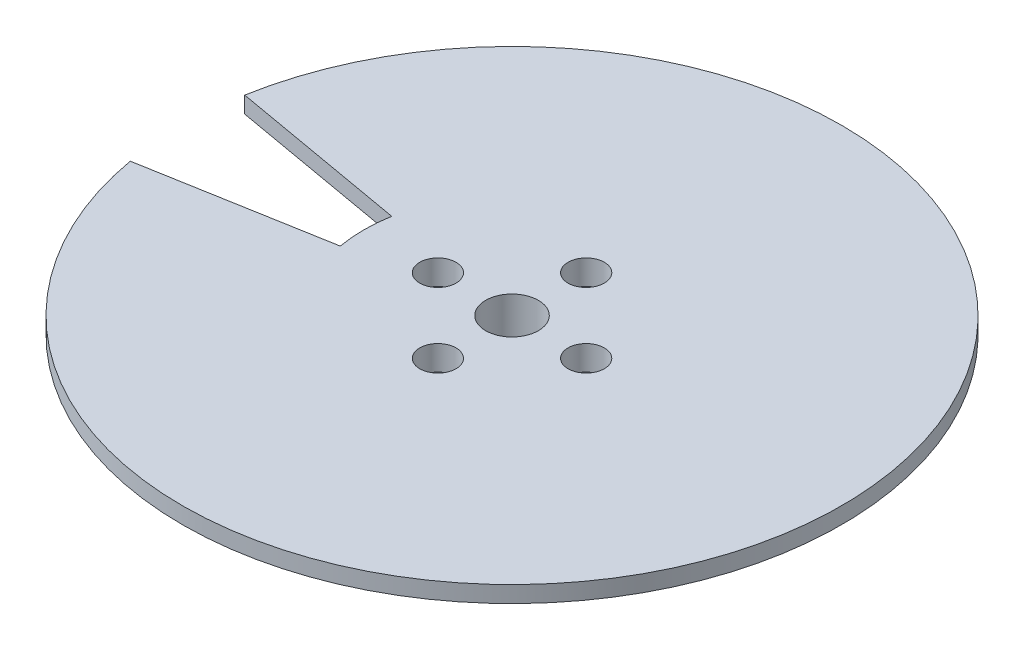
ISO-10303-21;
HEADER;
FILE_DESCRIPTION(('STEP AP214'),'2;1');
FILE_NAME('part.step','',(''),(''),'','','');
FILE_SCHEMA(('AUTOMOTIVE_DESIGN { 1 0 10303 214 1 1 1 1 }'));
ENDSEC;
DATA;
#1=APPLICATION_CONTEXT('core data for automotive mechanical design processes');
#2=APPLICATION_PROTOCOL_DEFINITION('international standard','automotive_design',2000,#1);
#3=PRODUCT_CONTEXT('',#1,'mechanical');
#4=PRODUCT('Part','Part','',(#3));
#5=PRODUCT_RELATED_PRODUCT_CATEGORY('part','',(#4));
#6=PRODUCT_DEFINITION_FORMATION('','',#4);
#7=PRODUCT_DEFINITION_CONTEXT('part definition',#1,'design');
#8=PRODUCT_DEFINITION('design','',#6,#7);
#9=PRODUCT_DEFINITION_SHAPE('','',#8);
#10=(LENGTH_UNIT() NAMED_UNIT(*) SI_UNIT(.MILLI.,.METRE.));
#11=(NAMED_UNIT(*) PLANE_ANGLE_UNIT() SI_UNIT($,.RADIAN.));
#12=(NAMED_UNIT(*) SI_UNIT($,.STERADIAN.) SOLID_ANGLE_UNIT());
#13=UNCERTAINTY_MEASURE_WITH_UNIT(LENGTH_MEASURE(1.E-05),#10,'distance_accuracy_value','');
#14=(GEOMETRIC_REPRESENTATION_CONTEXT(3) GLOBAL_UNCERTAINTY_ASSIGNED_CONTEXT((#13)) GLOBAL_UNIT_ASSIGNED_CONTEXT((#10,
#11,#12)) REPRESENTATION_CONTEXT('',''));
#15=CARTESIAN_POINT('',(0.,0.,0.));
#16=DIRECTION('',(0.,0.,1.));
#17=DIRECTION('',(1.,0.,0.));
#18=AXIS2_PLACEMENT_3D('',#15,#16,#17);
#19=CARTESIAN_POINT('',(0.,6.,0.));
#20=DIRECTION('',(0.,-1.,0.));
#21=DIRECTION('',(0.,0.,-1.));
#22=AXIS2_PLACEMENT_3D('',#19,#20,#21);
#23=CYLINDRICAL_SURFACE('',#22,7.5);
#24=DIRECTION('',(0.,-1.,0.));
#25=VECTOR('',#24,1.);
#26=CARTESIAN_POINT('',(0.85655319119696,3.,7.4509272329456));
#27=LINE('',#26,#25);
#28=CARTESIAN_POINT('',(0.856553191196959,3.,7.45092723294559));
#29=VERTEX_POINT('',#28);
#30=CARTESIAN_POINT('',(0.856553191196959,0.,7.45092723294559));
#31=VERTEX_POINT('',#30);
#32=EDGE_CURVE('E198',#29,#31,#27,.T.);
#33=ORIENTED_EDGE('',*,*,#32,.F.);
#34=CARTESIAN_POINT('',(0.,3.,0.));
#35=DIRECTION('',(0.,1.,0.));
#36=DIRECTION('',(0.,0.,1.));
#37=AXIS2_PLACEMENT_3D('',#34,#35,#36);
#38=CIRCLE('',#37,7.5);
#39=CARTESIAN_POINT('',(7.44042990767575,3.,0.943399591352612));
#40=VERTEX_POINT('',#39);
#41=EDGE_CURVE('E180',#29,#40,#38,.T.);
#42=ORIENTED_EDGE('',*,*,#41,.T.);
#43=DIRECTION('',(0.,-1.,0.));
#44=VECTOR('',#43,1.);
#45=CARTESIAN_POINT('',(7.44042990767575,3.,0.943399591352612));
#46=LINE('',#45,#44);
#47=CARTESIAN_POINT('',(7.44042990767575,0.,0.943399591352612));
#48=VERTEX_POINT('',#47);
#49=EDGE_CURVE('E356',#40,#48,#46,.T.);
#50=ORIENTED_EDGE('',*,*,#49,.T.);
#51=CARTESIAN_POINT('',(0.,0.,0.));
#52=DIRECTION('',(0.,1.,0.));
#53=DIRECTION('',(0.,0.,1.));
#54=AXIS2_PLACEMENT_3D('',#51,#52,#53);
#55=CIRCLE('',#54,7.5);
#56=EDGE_CURVE('E207',#31,#48,#55,.T.);
#57=ORIENTED_EDGE('',*,*,#56,.F.);
#58=EDGE_LOOP('',(#33,#42,#50,#57));
#59=FACE_BOUND('',#58,.T.);
#60=ADVANCED_FACE('F43',(#59),#23,.F.);
#61=DIRECTION('',(0.,-1.,0.));
#62=VECTOR('',#61,1.);
#63=CARTESIAN_POINT('',(7.45092723294559,3.,-0.856553191196986));
#64=LINE('',#63,#62);
#65=CARTESIAN_POINT('',(7.45092723294559,3.,-0.856553191196986));
#66=VERTEX_POINT('',#65);
#67=CARTESIAN_POINT('',(7.45092723294559,0.,-0.856553191196986));
#68=VERTEX_POINT('',#67);
#69=EDGE_CURVE('E352',#66,#68,#64,.T.);
#70=ORIENTED_EDGE('',*,*,#69,.F.);
#71=CARTESIAN_POINT('',(0.943399591352586,3.,-7.44042990767575));
#72=VERTEX_POINT('',#71);
#73=EDGE_CURVE('E192',#66,#72,#38,.T.);
#74=ORIENTED_EDGE('',*,*,#73,.T.);
#75=DIRECTION('',(0.,-1.,0.));
#76=VECTOR('',#75,1.);
#77=CARTESIAN_POINT('',(0.943399591352589,3.,-7.44042990767575));
#78=LINE('',#77,#76);
#79=CARTESIAN_POINT('',(0.943399591352589,0.,-7.44042990767575));
#80=VERTEX_POINT('',#79);
#81=EDGE_CURVE('E330',#72,#80,#78,.T.);
#82=ORIENTED_EDGE('',*,*,#81,.T.);
#83=EDGE_CURVE('E249',#68,#80,#55,.T.);
#84=ORIENTED_EDGE('',*,*,#83,.F.);
#85=EDGE_LOOP('',(#70,#74,#82,#84));
#86=FACE_BOUND('',#85,.T.);
#87=ADVANCED_FACE('F274',(#86),#23,.F.);
#88=DIRECTION('',(0.,-1.,0.));
#89=VECTOR('',#88,1.);
#90=CARTESIAN_POINT('',(-0.856553191197012,3.,-7.45092723294559));
#91=LINE('',#90,#89);
#92=CARTESIAN_POINT('',(-0.856553191197011,3.,-7.45092723294559));
#93=VERTEX_POINT('',#92);
#94=CARTESIAN_POINT('',(-0.856553191197012,0.,-7.45092723294559));
#95=VERTEX_POINT('',#94);
#96=EDGE_CURVE('E327',#93,#95,#91,.T.);
#97=ORIENTED_EDGE('',*,*,#96,.F.);
#98=CARTESIAN_POINT('',(-7.44042990767575,3.,-0.943399591352559));
#99=VERTEX_POINT('',#98);
#100=EDGE_CURVE('E393',#93,#99,#38,.T.);
#101=ORIENTED_EDGE('',*,*,#100,.T.);
#102=DIRECTION('',(0.,-1.,0.));
#103=VECTOR('',#102,1.);
#104=CARTESIAN_POINT('',(-7.44042990767576,3.,-0.943399591352555));
#105=LINE('',#104,#103);
#106=CARTESIAN_POINT('',(-7.44042990767576,0.,-0.943399591352555));
#107=VERTEX_POINT('',#106);
#108=EDGE_CURVE('E303',#99,#107,#105,.T.);
#109=ORIENTED_EDGE('',*,*,#108,.T.);
#110=EDGE_CURVE('E406',#95,#107,#55,.T.);
#111=ORIENTED_EDGE('',*,*,#110,.F.);
#112=EDGE_LOOP('',(#97,#101,#109,#111));
#113=FACE_BOUND('',#112,.T.);
#114=ADVANCED_FACE('F281',(#113),#23,.F.);
#115=DIRECTION('',(0.,-1.,0.));
#116=VECTOR('',#115,1.);
#117=CARTESIAN_POINT('',(-7.45092723294559,3.,0.856553191197039));
#118=LINE('',#117,#116);
#119=CARTESIAN_POINT('',(-7.45092723294559,3.,0.856553191197039));
#120=VERTEX_POINT('',#119);
#121=CARTESIAN_POINT('',(-7.45092723294559,0.,0.856553191197038));
#122=VERTEX_POINT('',#121);
#123=EDGE_CURVE('E298',#120,#122,#118,.T.);
#124=ORIENTED_EDGE('',*,*,#123,.F.);
#125=CARTESIAN_POINT('',(-0.943399591352638,3.,7.44042990767574));
#126=VERTEX_POINT('',#125);
#127=EDGE_CURVE('E194',#120,#126,#38,.T.);
#128=ORIENTED_EDGE('',*,*,#127,.T.);
#129=DIRECTION('',(0.,-1.,0.));
#130=VECTOR('',#129,1.);
#131=CARTESIAN_POINT('',(-0.943399591352635,3.,7.44042990767575));
#132=LINE('',#131,#130);
#133=CARTESIAN_POINT('',(-0.943399591352635,0.,7.44042990767575));
#134=VERTEX_POINT('',#133);
#135=EDGE_CURVE('E208',#126,#134,#132,.T.);
#136=ORIENTED_EDGE('',*,*,#135,.T.);
#137=EDGE_CURVE('E240',#122,#134,#55,.T.);
#138=ORIENTED_EDGE('',*,*,#137,.F.);
#139=EDGE_LOOP('',(#124,#128,#136,#138));
#140=FACE_BOUND('',#139,.T.);
#141=ADVANCED_FACE('F276',(#140),#23,.F.);
#142=CARTESIAN_POINT('',(0.,6.,0.));
#143=DIRECTION('',(0.,1.,0.));
#144=DIRECTION('',(0.,0.,1.));
#145=AXIS2_PLACEMENT_3D('',#142,#143,#144);
#146=PLANE('',#145);
#147=CARTESIAN_POINT('',(0.,6.,-4.5));
#148=DIRECTION('',(0.,1.,0.));
#149=DIRECTION('',(0.,0.,1.));
#150=AXIS2_PLACEMENT_3D('',#147,#148,#149);
#151=CIRCLE('',#150,1.1);
#152=CARTESIAN_POINT('',(0.,6.,-3.4));
#153=VERTEX_POINT('',#152);
#154=EDGE_CURVE('E743',#153,#153,#151,.T.);
#155=ORIENTED_EDGE('',*,*,#154,.F.);
#156=EDGE_LOOP('',(#155));
#157=FACE_BOUND('',#156,.T.);
#158=CARTESIAN_POINT('',(4.5,6.,0.));
#159=DIRECTION('',(0.,1.,0.));
#160=DIRECTION('',(0.,0.,1.));
#161=AXIS2_PLACEMENT_3D('',#158,#159,#160);
#162=CIRCLE('',#161,1.1);
#163=CARTESIAN_POINT('',(4.5,6.,1.1));
#164=VERTEX_POINT('',#163);
#165=EDGE_CURVE('E747',#164,#164,#162,.T.);
#166=ORIENTED_EDGE('',*,*,#165,.F.);
#167=EDGE_LOOP('',(#166));
#168=FACE_BOUND('',#167,.T.);
#169=CARTESIAN_POINT('',(0.,6.,4.5));
#170=DIRECTION('',(0.,1.,0.));
#171=DIRECTION('',(0.,0.,1.));
#172=AXIS2_PLACEMENT_3D('',#169,#170,#171);
#173=CIRCLE('',#172,1.1);
#174=CARTESIAN_POINT('',(0.,6.,5.6));
#175=VERTEX_POINT('',#174);
#176=EDGE_CURVE('E755',#175,#175,#173,.T.);
#177=ORIENTED_EDGE('',*,*,#176,.F.);
#178=EDGE_LOOP('',(#177));
#179=FACE_BOUND('',#178,.T.);
#180=CARTESIAN_POINT('',(-4.5,6.,0.));
#181=DIRECTION('',(0.,1.,0.));
#182=DIRECTION('',(0.,0.,1.));
#183=AXIS2_PLACEMENT_3D('',#180,#181,#182);
#184=CIRCLE('',#183,1.1);
#185=CARTESIAN_POINT('',(-4.5,6.,1.1));
#186=VERTEX_POINT('',#185);
#187=EDGE_CURVE('E761',#186,#186,#184,.T.);
#188=ORIENTED_EDGE('',*,*,#187,.F.);
#189=EDGE_LOOP('',(#188));
#190=FACE_BOUND('',#189,.T.);
#191=CARTESIAN_POINT('',(0.,6.,0.));
#192=DIRECTION('',(0.,1.,0.));
#193=DIRECTION('',(0.,0.,1.));
#194=AXIS2_PLACEMENT_3D('',#191,#192,#193);
#195=CIRCLE('',#194,1.6);
#196=CARTESIAN_POINT('',(0.,6.,1.6));
#197=VERTEX_POINT('',#196);
#198=EDGE_CURVE('E742',#197,#197,#195,.T.);
#199=ORIENTED_EDGE('',*,*,#198,.F.);
#200=EDGE_LOOP('',(#199));
#201=FACE_BOUND('',#200,.T.);
#202=CARTESIAN_POINT('',(0.,6.,0.));
#203=DIRECTION('',(0.,1.,0.));
#204=DIRECTION('',(0.,0.,1.));
#205=AXIS2_PLACEMENT_3D('',#202,#203,#204);
#206=CIRCLE('',#205,9.);
#207=CARTESIAN_POINT('',(-8.86326977710987,6.,-1.56283359900238));
#208=VERTEX_POINT('',#207);
#209=CARTESIAN_POINT('',(-8.86326977710987,6.,1.56283359900238));
#210=VERTEX_POINT('',#209);
#211=EDGE_CURVE('E248',#208,#210,#206,.T.);
#212=ORIENTED_EDGE('',*,*,#211,.T.);
#213=DIRECTION('',(-0.984807753012208,0.,0.173648177666931));
#214=VECTOR('',#213,1.);
#215=CARTESIAN_POINT('',(0.,6.,0.));
#216=LINE('',#215,#214);
#217=CARTESIAN_POINT('',(-19.6961550602442,6.,3.47296355333863));
#218=VERTEX_POINT('',#217);
#219=EDGE_CURVE('E229',#210,#218,#216,.T.);
#220=ORIENTED_EDGE('',*,*,#219,.T.);
#221=CARTESIAN_POINT('',(0.,6.,0.));
#222=DIRECTION('',(0.,1.,0.));
#223=DIRECTION('',(0.,0.,1.));
#224=AXIS2_PLACEMENT_3D('',#221,#222,#223);
#225=CIRCLE('',#224,20.);
#226=CARTESIAN_POINT('',(-19.6961550602442,6.,-3.47296355333861));
#227=VERTEX_POINT('',#226);
#228=EDGE_CURVE('E232',#218,#227,#225,.T.);
#229=ORIENTED_EDGE('',*,*,#228,.T.);
#230=DIRECTION('',(-0.984807753012208,0.,-0.173648177666931));
#231=VECTOR('',#230,1.);
#232=CARTESIAN_POINT('',(0.,6.,0.));
#233=LINE('',#232,#231);
#234=EDGE_CURVE('E221',#208,#227,#233,.T.);
#235=ORIENTED_EDGE('',*,*,#234,.F.);
#236=EDGE_LOOP('',(#212,#220,#229,#235));
#237=FACE_BOUND('',#236,.T.);
#238=ADVANCED_FACE('F286',(#157,#168,#179,#190,#201,#237),#146,.T.);
#239=CARTESIAN_POINT('',(0.,0.,0.));
#240=DIRECTION('',(0.,1.,0.));
#241=DIRECTION('',(0.,0.,1.));
#242=AXIS2_PLACEMENT_3D('',#239,#240,#241);
#243=PLANE('',#242);
#244=CARTESIAN_POINT('',(0.,0.,0.));
#245=DIRECTION('',(0.,1.,0.));
#246=DIRECTION('',(0.,0.,1.));
#247=AXIS2_PLACEMENT_3D('',#244,#245,#246);
#248=CIRCLE('',#247,7.99999999999999);
#249=CARTESIAN_POINT('',(0.,0.,7.99999999999999));
#250=VERTEX_POINT('',#249);
#251=EDGE_CURVE('E11',#250,#250,#248,.F.);
#252=ORIENTED_EDGE('',*,*,#251,.T.);
#253=EDGE_LOOP('',(#252));
#254=FACE_BOUND('',#253,.T.);
#255=ORIENTED_EDGE('',*,*,#56,.T.);
#256=DIRECTION('',(-1.,0.,0.));
#257=VECTOR('',#256,1.);
#258=CARTESIAN_POINT('',(6.3123397412791,0.,0.943399591352637));
#259=LINE('',#258,#257);
#260=CARTESIAN_POINT('',(5.41848661630125,0.,0.943399591352619));
#261=VERTEX_POINT('',#260);
#262=EDGE_CURVE('E365',#48,#261,#259,.T.);
#263=ORIENTED_EDGE('',*,*,#262,.T.);
#264=CARTESIAN_POINT('',(0.,0.,0.));
#265=DIRECTION('',(0.,1.,0.));
#266=DIRECTION('',(0.,0.,-1.));
#267=AXIS2_PLACEMENT_3D('',#264,#265,#266);
#268=CIRCLE('',#267,5.5);
#269=CARTESIAN_POINT('',(5.43289210555946,0.,-0.856553191196978));
#270=VERTEX_POINT('',#269);
#271=EDGE_CURVE('E362',#261,#270,#268,.T.);
#272=ORIENTED_EDGE('',*,*,#271,.T.);
#273=DIRECTION('',(1.,0.,0.));
#274=VECTOR('',#273,1.);
#275=CARTESIAN_POINT('',(6.32608265113426,0.,-0.856553191196982));
#276=LINE('',#275,#274);
#277=EDGE_CURVE('E369',#270,#68,#276,.T.);
#278=ORIENTED_EDGE('',*,*,#277,.T.);
#279=ORIENTED_EDGE('',*,*,#83,.T.);
#280=DIRECTION('',(0.,0.,1.));
#281=VECTOR('',#280,1.);
#282=CARTESIAN_POINT('',(0.943399591352638,0.,-6.3123397412791));
#283=LINE('',#282,#281);
#284=CARTESIAN_POINT('',(0.9433995913526,0.,-5.41848661630125));
#285=VERTEX_POINT('',#284);
#286=EDGE_CURVE('E339',#80,#285,#283,.T.);
#287=ORIENTED_EDGE('',*,*,#286,.T.);
#288=CARTESIAN_POINT('',(0.,0.,0.));
#289=DIRECTION('',(0.,1.,0.));
#290=DIRECTION('',(0.,0.,-1.));
#291=AXIS2_PLACEMENT_3D('',#288,#289,#290);
#292=CIRCLE('',#291,5.5);
#293=CARTESIAN_POINT('',(-0.856553191196997,0.,-5.43289210555945));
#294=VERTEX_POINT('',#293);
#295=EDGE_CURVE('E337',#285,#294,#292,.T.);
#296=ORIENTED_EDGE('',*,*,#295,.T.);
#297=DIRECTION('',(0.,0.,-1.));
#298=VECTOR('',#297,1.);
#299=CARTESIAN_POINT('',(-0.856553191197004,0.,-6.32608265113425));
#300=LINE('',#299,#298);
#301=EDGE_CURVE('E66',#294,#95,#300,.T.);
#302=ORIENTED_EDGE('',*,*,#301,.T.);
#303=ORIENTED_EDGE('',*,*,#110,.T.);
#304=DIRECTION('',(1.,0.,0.));
#305=VECTOR('',#304,1.);
#306=CARTESIAN_POINT('',(-6.3123397412791,0.,-0.943399591352638));
#307=LINE('',#306,#305);
#308=CARTESIAN_POINT('',(-5.41848661630125,0.,-0.943399591352581));
#309=VERTEX_POINT('',#308);
#310=EDGE_CURVE('E318',#107,#309,#307,.T.);
#311=ORIENTED_EDGE('',*,*,#310,.T.);
#312=CARTESIAN_POINT('',(0.,0.,0.));
#313=DIRECTION('',(0.,1.,0.));
#314=DIRECTION('',(0.,0.,-1.));
#315=AXIS2_PLACEMENT_3D('',#312,#313,#314);
#316=CIRCLE('',#315,5.5);
#317=CARTESIAN_POINT('',(-5.43289210555945,0.,0.856553191197016));
#318=VERTEX_POINT('',#317);
#319=EDGE_CURVE('E316',#309,#318,#316,.T.);
#320=ORIENTED_EDGE('',*,*,#319,.T.);
#321=DIRECTION('',(-1.,0.,0.));
#322=VECTOR('',#321,1.);
#323=CARTESIAN_POINT('',(-6.32608265113425,0.,0.856553191197027));
#324=LINE('',#323,#322);
#325=EDGE_CURVE('E59',#318,#122,#324,.T.);
#326=ORIENTED_EDGE('',*,*,#325,.T.);
#327=ORIENTED_EDGE('',*,*,#137,.T.);
#328=DIRECTION('',(0.,0.,-1.));
#329=VECTOR('',#328,1.);
#330=CARTESIAN_POINT('',(-0.943399591352637,0.,6.3123397412791));
#331=LINE('',#330,#329);
#332=CARTESIAN_POINT('',(-0.943399591352638,0.,5.41848661630124));
#333=VERTEX_POINT('',#332);
#334=EDGE_CURVE('E380',#134,#333,#331,.T.);
#335=ORIENTED_EDGE('',*,*,#334,.T.);
#336=CARTESIAN_POINT('',(0.,0.,0.));
#337=DIRECTION('',(0.,1.,0.));
#338=DIRECTION('',(0.,0.,-1.));
#339=AXIS2_PLACEMENT_3D('',#336,#337,#338);
#340=CIRCLE('',#339,5.5);
#341=CARTESIAN_POINT('',(0.85655319119696,0.,5.43289210555946));
#342=VERTEX_POINT('',#341);
#343=EDGE_CURVE('E204',#333,#342,#340,.T.);
#344=ORIENTED_EDGE('',*,*,#343,.T.);
#345=DIRECTION('',(0.,0.,1.));
#346=VECTOR('',#345,1.);
#347=CARTESIAN_POINT('',(0.85655319119696,0.,6.32608265113426));
#348=LINE('',#347,#346);
#349=EDGE_CURVE('E371',#342,#31,#348,.T.);
#350=ORIENTED_EDGE('',*,*,#349,.T.);
#351=EDGE_LOOP('',(#255,#263,#272,#278,#279,#287,#296,#302,#303,#311,#320,#326,#327,#335,#344,#350));
#352=FACE_BOUND('',#351,.T.);
#353=ADVANCED_FACE('F292',(#254,#352),#243,.F.);
#354=CARTESIAN_POINT('',(0.,6.,0.));
#355=DIRECTION('',(0.,-1.,0.));
#356=DIRECTION('',(0.,0.,-1.));
#357=AXIS2_PLACEMENT_3D('',#354,#355,#356);
#358=CYLINDRICAL_SURFACE('',#357,9.);
#359=CARTESIAN_POINT('',(0.,1.00000000000001,0.));
#360=DIRECTION('',(0.,1.,0.));
#361=DIRECTION('',(0.,0.,1.));
#362=AXIS2_PLACEMENT_3D('',#359,#360,#361);
#363=CIRCLE('',#362,9.);
#364=CARTESIAN_POINT('',(0.,1.00000000000001,9.));
#365=VERTEX_POINT('',#364);
#366=EDGE_CURVE('E52',#365,#365,#363,.T.);
#367=ORIENTED_EDGE('',*,*,#366,.T.);
#368=EDGE_LOOP('',(#367));
#369=FACE_BOUND('',#368,.T.);
#370=CARTESIAN_POINT('',(0.,5.,0.));
#371=DIRECTION('',(0.,1.,0.));
#372=DIRECTION('',(0.,0.,1.));
#373=AXIS2_PLACEMENT_3D('',#370,#371,#372);
#374=CIRCLE('',#373,9.);
#375=CARTESIAN_POINT('',(-8.86326977710987,5.,1.56283359900238));
#376=VERTEX_POINT('',#375);
#377=CARTESIAN_POINT('',(-8.86326977710987,5.,-1.56283359900238));
#378=VERTEX_POINT('',#377);
#379=EDGE_CURVE('E226',#376,#378,#374,.T.);
#380=ORIENTED_EDGE('',*,*,#379,.F.);
#381=DIRECTION('',(0.,1.,0.));
#382=VECTOR('',#381,1.);
#383=CARTESIAN_POINT('',(-8.86326977710987,5.,1.56283359900238));
#384=LINE('',#383,#382);
#385=EDGE_CURVE('E237',#376,#210,#384,.T.);
#386=ORIENTED_EDGE('',*,*,#385,.T.);
#387=ORIENTED_EDGE('',*,*,#211,.F.);
#388=DIRECTION('',(0.,1.,0.));
#389=VECTOR('',#388,1.);
#390=CARTESIAN_POINT('',(-8.86326977710987,5.,-1.56283359900238));
#391=LINE('',#390,#389);
#392=EDGE_CURVE('E241',#378,#208,#391,.T.);
#393=ORIENTED_EDGE('',*,*,#392,.F.);
#394=EDGE_LOOP('',(#380,#386,#387,#393));
#395=FACE_BOUND('',#394,.T.);
#396=ADVANCED_FACE('F254',(#369,#395),#358,.T.);
#397=CARTESIAN_POINT('',(0.,5.,0.));
#398=DIRECTION('',(-0.173648177666931,0.,-0.984807753012208));
#399=DIRECTION('',(-0.984807753012208,0.,0.173648177666931));
#400=AXIS2_PLACEMENT_3D('',#397,#398,#399);
#401=PLANE('',#400);
#402=ORIENTED_EDGE('',*,*,#219,.F.);
#403=ORIENTED_EDGE('',*,*,#385,.F.);
#404=DIRECTION('',(-0.984807753012208,0.,0.173648177666931));
#405=VECTOR('',#404,1.);
#406=CARTESIAN_POINT('',(0.,5.,0.));
#407=LINE('',#406,#405);
#408=CARTESIAN_POINT('',(-19.6961550602442,5.,3.47296355333863));
#409=VERTEX_POINT('',#408);
#410=EDGE_CURVE('E217',#376,#409,#407,.T.);
#411=ORIENTED_EDGE('',*,*,#410,.T.);
#412=DIRECTION('',(0.,1.,0.));
#413=VECTOR('',#412,1.);
#414=CARTESIAN_POINT('',(-19.6961550602442,5.,3.47296355333863));
#415=LINE('',#414,#413);
#416=EDGE_CURVE('E228',#409,#218,#415,.T.);
#417=ORIENTED_EDGE('',*,*,#416,.T.);
#418=EDGE_LOOP('',(#402,#403,#411,#417));
#419=FACE_BOUND('',#418,.T.);
#420=ADVANCED_FACE('F452',(#419),#401,.T.);
#421=CARTESIAN_POINT('',(0.,5.,0.));
#422=DIRECTION('',(0.173648177666931,0.,-0.984807753012208));
#423=DIRECTION('',(-0.984807753012208,0.,-0.173648177666931));
#424=AXIS2_PLACEMENT_3D('',#421,#422,#423);
#425=PLANE('',#424);
#426=ORIENTED_EDGE('',*,*,#234,.T.);
#427=DIRECTION('',(0.,1.,0.));
#428=VECTOR('',#427,1.);
#429=CARTESIAN_POINT('',(-19.6961550602442,5.,-3.47296355333861));
#430=LINE('',#429,#428);
#431=CARTESIAN_POINT('',(-19.6961550602442,5.,-3.47296355333861));
#432=VERTEX_POINT('',#431);
#433=EDGE_CURVE('E244',#432,#227,#430,.T.);
#434=ORIENTED_EDGE('',*,*,#433,.F.);
#435=DIRECTION('',(-0.984807753012208,0.,-0.173648177666931));
#436=VECTOR('',#435,1.);
#437=CARTESIAN_POINT('',(0.,5.,0.));
#438=LINE('',#437,#436);
#439=EDGE_CURVE('E224',#378,#432,#438,.T.);
#440=ORIENTED_EDGE('',*,*,#439,.F.);
#441=ORIENTED_EDGE('',*,*,#392,.T.);
#442=EDGE_LOOP('',(#426,#434,#440,#441));
#443=FACE_BOUND('',#442,.T.);
#444=ADVANCED_FACE('F449',(#443),#425,.F.);
#445=CARTESIAN_POINT('',(0.,5.,0.));
#446=DIRECTION('',(0.,1.,0.));
#447=DIRECTION('',(0.,0.,1.));
#448=AXIS2_PLACEMENT_3D('',#445,#446,#447);
#449=CYLINDRICAL_SURFACE('',#448,20.);
#450=ORIENTED_EDGE('',*,*,#228,.F.);
#451=ORIENTED_EDGE('',*,*,#416,.F.);
#452=CARTESIAN_POINT('',(0.,5.,0.));
#453=DIRECTION('',(0.,1.,0.));
#454=DIRECTION('',(0.,0.,1.));
#455=AXIS2_PLACEMENT_3D('',#452,#453,#454);
#456=CIRCLE('',#455,20.);
#457=EDGE_CURVE('E220',#409,#432,#456,.T.);
#458=ORIENTED_EDGE('',*,*,#457,.T.);
#459=ORIENTED_EDGE('',*,*,#433,.T.);
#460=EDGE_LOOP('',(#450,#451,#458,#459));
#461=FACE_BOUND('',#460,.T.);
#462=ADVANCED_FACE('F447',(#461),#449,.T.);
#463=CARTESIAN_POINT('',(0.,5.,0.));
#464=DIRECTION('',(0.,1.,0.));
#465=DIRECTION('',(0.,0.,1.));
#466=AXIS2_PLACEMENT_3D('',#463,#464,#465);
#467=PLANE('',#466);
#468=ORIENTED_EDGE('',*,*,#410,.F.);
#469=ORIENTED_EDGE('',*,*,#379,.T.);
#470=ORIENTED_EDGE('',*,*,#439,.T.);
#471=ORIENTED_EDGE('',*,*,#457,.F.);
#472=EDGE_LOOP('',(#468,#469,#470,#471));
#473=FACE_BOUND('',#472,.T.);
#474=ADVANCED_FACE('F441',(#473),#467,.F.);
#475=CARTESIAN_POINT('',(0.,3.,0.));
#476=DIRECTION('',(0.,-1.,0.));
#477=DIRECTION('',(0.,0.,-1.));
#478=AXIS2_PLACEMENT_3D('',#475,#476,#477);
#479=CYLINDRICAL_SURFACE('',#478,5.5);
#480=ORIENTED_EDGE('',*,*,#343,.F.);
#481=DIRECTION('',(0.,-1.,0.));
#482=VECTOR('',#481,1.);
#483=CARTESIAN_POINT('',(-0.943399591352638,3.,5.41848661630124));
#484=LINE('',#483,#482);
#485=CARTESIAN_POINT('',(-0.943399591352638,3.,5.41848661630124));
#486=VERTEX_POINT('',#485);
#487=EDGE_CURVE('E212',#486,#333,#484,.T.);
#488=ORIENTED_EDGE('',*,*,#487,.F.);
#489=CARTESIAN_POINT('',(0.,3.,0.));
#490=DIRECTION('',(0.,1.,0.));
#491=DIRECTION('',(0.,0.,-1.));
#492=AXIS2_PLACEMENT_3D('',#489,#490,#491);
#493=CIRCLE('',#492,5.5);
#494=CARTESIAN_POINT('',(0.85655319119696,3.,5.43289210555946));
#495=VERTEX_POINT('',#494);
#496=EDGE_CURVE('E209',#486,#495,#493,.T.);
#497=ORIENTED_EDGE('',*,*,#496,.T.);
#498=DIRECTION('',(0.,-1.,0.));
#499=VECTOR('',#498,1.);
#500=CARTESIAN_POINT('',(0.85655319119696,3.,5.43289210555946));
#501=LINE('',#500,#499);
#502=EDGE_CURVE('E201',#495,#342,#501,.T.);
#503=ORIENTED_EDGE('',*,*,#502,.T.);
#504=EDGE_LOOP('',(#480,#488,#497,#503));
#505=FACE_BOUND('',#504,.T.);
#506=ADVANCED_FACE('F391',(#505),#479,.F.);
#507=CARTESIAN_POINT('',(-0.943399591352637,3.,6.3123397412791));
#508=DIRECTION('',(-1.,0.,0.));
#509=DIRECTION('',(0.,0.,1.));
#510=AXIS2_PLACEMENT_3D('',#507,#508,#509);
#511=PLANE('',#510);
#512=ORIENTED_EDGE('',*,*,#334,.F.);
#513=ORIENTED_EDGE('',*,*,#135,.F.);
#514=DIRECTION('',(0.,0.,-1.));
#515=VECTOR('',#514,1.);
#516=CARTESIAN_POINT('',(-0.943399591352637,3.,6.3123397412791));
#517=LINE('',#516,#515);
#518=EDGE_CURVE('E203',#126,#486,#517,.T.);
#519=ORIENTED_EDGE('',*,*,#518,.T.);
#520=ORIENTED_EDGE('',*,*,#487,.T.);
#521=EDGE_LOOP('',(#512,#513,#519,#520));
#522=FACE_BOUND('',#521,.T.);
#523=ADVANCED_FACE('F388',(#522),#511,.T.);
#524=CARTESIAN_POINT('',(0.85655319119696,3.,6.32608265113426));
#525=DIRECTION('',(1.,0.,0.));
#526=DIRECTION('',(0.,0.,-1.));
#527=AXIS2_PLACEMENT_3D('',#524,#525,#526);
#528=PLANE('',#527);
#529=ORIENTED_EDGE('',*,*,#349,.F.);
#530=ORIENTED_EDGE('',*,*,#502,.F.);
#531=DIRECTION('',(0.,0.,1.));
#532=VECTOR('',#531,1.);
#533=CARTESIAN_POINT('',(0.85655319119696,3.,6.32608265113426));
#534=LINE('',#533,#532);
#535=EDGE_CURVE('E183',#495,#29,#534,.T.);
#536=ORIENTED_EDGE('',*,*,#535,.T.);
#537=ORIENTED_EDGE('',*,*,#32,.T.);
#538=EDGE_LOOP('',(#529,#530,#536,#537));
#539=FACE_BOUND('',#538,.T.);
#540=ADVANCED_FACE('F197',(#539),#528,.T.);
#541=CARTESIAN_POINT('',(0.,3.,0.));
#542=DIRECTION('',(0.,-1.,0.));
#543=DIRECTION('',(0.,0.,-1.));
#544=AXIS2_PLACEMENT_3D('',#541,#542,#543);
#545=CYLINDRICAL_SURFACE('',#544,5.5);
#546=ORIENTED_EDGE('',*,*,#271,.F.);
#547=DIRECTION('',(0.,-1.,0.));
#548=VECTOR('',#547,1.);
#549=CARTESIAN_POINT('',(5.41848661630125,3.,0.943399591352619));
#550=LINE('',#549,#548);
#551=CARTESIAN_POINT('',(5.41848661630125,3.,0.943399591352619));
#552=VERTEX_POINT('',#551);
#553=EDGE_CURVE('E358',#552,#261,#550,.T.);
#554=ORIENTED_EDGE('',*,*,#553,.F.);
#555=CARTESIAN_POINT('',(0.,3.,0.));
#556=DIRECTION('',(0.,1.,0.));
#557=DIRECTION('',(0.,0.,-1.));
#558=AXIS2_PLACEMENT_3D('',#555,#556,#557);
#559=CIRCLE('',#558,5.5);
#560=CARTESIAN_POINT('',(5.43289210555946,3.,-0.856553191196979));
#561=VERTEX_POINT('',#560);
#562=EDGE_CURVE('E355',#552,#561,#559,.T.);
#563=ORIENTED_EDGE('',*,*,#562,.T.);
#564=DIRECTION('',(0.,-1.,0.));
#565=VECTOR('',#564,1.);
#566=CARTESIAN_POINT('',(5.43289210555946,3.,-0.856553191196978));
#567=LINE('',#566,#565);
#568=EDGE_CURVE('E344',#561,#270,#567,.T.);
#569=ORIENTED_EDGE('',*,*,#568,.T.);
#570=EDGE_LOOP('',(#546,#554,#563,#569));
#571=FACE_BOUND('',#570,.T.);
#572=ADVANCED_FACE('F427',(#571),#545,.F.);
#573=CARTESIAN_POINT('',(6.3123397412791,3.,0.943399591352637));
#574=DIRECTION('',(0.,0.,1.));
#575=DIRECTION('',(1.,0.,0.));
#576=AXIS2_PLACEMENT_3D('',#573,#574,#575);
#577=PLANE('',#576);
#578=ORIENTED_EDGE('',*,*,#262,.F.);
#579=ORIENTED_EDGE('',*,*,#49,.F.);
#580=DIRECTION('',(-1.,0.,0.));
#581=VECTOR('',#580,1.);
#582=CARTESIAN_POINT('',(6.3123397412791,3.,0.943399591352637));
#583=LINE('',#582,#581);
#584=EDGE_CURVE('E186',#40,#552,#583,.T.);
#585=ORIENTED_EDGE('',*,*,#584,.T.);
#586=ORIENTED_EDGE('',*,*,#553,.T.);
#587=EDGE_LOOP('',(#578,#579,#585,#586));
#588=FACE_BOUND('',#587,.T.);
#589=ADVANCED_FACE('F429',(#588),#577,.T.);
#590=CARTESIAN_POINT('',(6.32608265113426,3.,-0.856553191196982));
#591=DIRECTION('',(0.,0.,-1.));
#592=DIRECTION('',(-1.,0.,0.));
#593=AXIS2_PLACEMENT_3D('',#590,#591,#592);
#594=PLANE('',#593);
#595=ORIENTED_EDGE('',*,*,#277,.F.);
#596=ORIENTED_EDGE('',*,*,#568,.F.);
#597=DIRECTION('',(1.,0.,0.));
#598=VECTOR('',#597,1.);
#599=CARTESIAN_POINT('',(6.32608265113426,3.,-0.856553191196982));
#600=LINE('',#599,#598);
#601=EDGE_CURVE('E366',#561,#66,#600,.T.);
#602=ORIENTED_EDGE('',*,*,#601,.T.);
#603=ORIENTED_EDGE('',*,*,#69,.T.);
#604=EDGE_LOOP('',(#595,#596,#602,#603));
#605=FACE_BOUND('',#604,.T.);
#606=ADVANCED_FACE('F423',(#605),#594,.T.);
#607=CARTESIAN_POINT('',(0.,3.,0.));
#608=DIRECTION('',(0.,-1.,0.));
#609=DIRECTION('',(0.,0.,-1.));
#610=AXIS2_PLACEMENT_3D('',#607,#608,#609);
#611=CYLINDRICAL_SURFACE('',#610,5.5);
#612=ORIENTED_EDGE('',*,*,#295,.F.);
#613=DIRECTION('',(0.,-1.,0.));
#614=VECTOR('',#613,1.);
#615=CARTESIAN_POINT('',(0.9433995913526,3.,-5.41848661630125));
#616=LINE('',#615,#614);
#617=CARTESIAN_POINT('',(0.9433995913526,3.,-5.41848661630125));
#618=VERTEX_POINT('',#617);
#619=EDGE_CURVE('E333',#618,#285,#616,.T.);
#620=ORIENTED_EDGE('',*,*,#619,.F.);
#621=CARTESIAN_POINT('',(0.,3.,0.));
#622=DIRECTION('',(0.,1.,0.));
#623=DIRECTION('',(0.,0.,-1.));
#624=AXIS2_PLACEMENT_3D('',#621,#622,#623);
#625=CIRCLE('',#624,5.5);
#626=CARTESIAN_POINT('',(-0.856553191196997,3.,-5.43289210555945));
#627=VERTEX_POINT('',#626);
#628=EDGE_CURVE('E329',#618,#627,#625,.T.);
#629=ORIENTED_EDGE('',*,*,#628,.T.);
#630=DIRECTION('',(0.,-1.,0.));
#631=VECTOR('',#630,1.);
#632=CARTESIAN_POINT('',(-0.856553191196997,3.,-5.43289210555945));
#633=LINE('',#632,#631);
#634=EDGE_CURVE('E322',#627,#294,#633,.T.);
#635=ORIENTED_EDGE('',*,*,#634,.T.);
#636=EDGE_LOOP('',(#612,#620,#629,#635));
#637=FACE_BOUND('',#636,.T.);
#638=ADVANCED_FACE('F417',(#637),#611,.F.);
#639=CARTESIAN_POINT('',(0.943399591352638,3.,-6.3123397412791));
#640=DIRECTION('',(1.,0.,0.));
#641=DIRECTION('',(0.,0.,-1.));
#642=AXIS2_PLACEMENT_3D('',#639,#640,#641);
#643=PLANE('',#642);
#644=ORIENTED_EDGE('',*,*,#286,.F.);
#645=ORIENTED_EDGE('',*,*,#81,.F.);
#646=DIRECTION('',(0.,0.,1.));
#647=VECTOR('',#646,1.);
#648=CARTESIAN_POINT('',(0.943399591352638,3.,-6.3123397412791));
#649=LINE('',#648,#647);
#650=EDGE_CURVE('E347',#72,#618,#649,.T.);
#651=ORIENTED_EDGE('',*,*,#650,.T.);
#652=ORIENTED_EDGE('',*,*,#619,.T.);
#653=EDGE_LOOP('',(#644,#645,#651,#652));
#654=FACE_BOUND('',#653,.T.);
#655=ADVANCED_FACE('F414',(#654),#643,.T.);
#656=CARTESIAN_POINT('',(-0.856553191197004,3.,-6.32608265113425));
#657=DIRECTION('',(-1.,0.,0.));
#658=DIRECTION('',(0.,0.,1.));
#659=AXIS2_PLACEMENT_3D('',#656,#657,#658);
#660=PLANE('',#659);
#661=ORIENTED_EDGE('',*,*,#301,.F.);
#662=ORIENTED_EDGE('',*,*,#634,.F.);
#663=DIRECTION('',(0.,0.,-1.));
#664=VECTOR('',#663,1.);
#665=CARTESIAN_POINT('',(-0.856553191197004,3.,-6.32608265113425));
#666=LINE('',#665,#664);
#667=EDGE_CURVE('E340',#627,#93,#666,.T.);
#668=ORIENTED_EDGE('',*,*,#667,.T.);
#669=ORIENTED_EDGE('',*,*,#96,.T.);
#670=EDGE_LOOP('',(#661,#662,#668,#669));
#671=FACE_BOUND('',#670,.T.);
#672=ADVANCED_FACE('F420',(#671),#660,.T.);
#673=CARTESIAN_POINT('',(0.,3.,0.));
#674=DIRECTION('',(0.,-1.,0.));
#675=DIRECTION('',(0.,0.,-1.));
#676=AXIS2_PLACEMENT_3D('',#673,#674,#675);
#677=CYLINDRICAL_SURFACE('',#676,5.5);
#678=ORIENTED_EDGE('',*,*,#319,.F.);
#679=DIRECTION('',(0.,-1.,0.));
#680=VECTOR('',#679,1.);
#681=CARTESIAN_POINT('',(-5.41848661630125,3.,-0.943399591352581));
#682=LINE('',#681,#680);
#683=CARTESIAN_POINT('',(-5.41848661630125,3.,-0.943399591352581));
#684=VERTEX_POINT('',#683);
#685=EDGE_CURVE('E309',#684,#309,#682,.T.);
#686=ORIENTED_EDGE('',*,*,#685,.F.);
#687=CARTESIAN_POINT('',(0.,3.,0.));
#688=DIRECTION('',(0.,1.,0.));
#689=DIRECTION('',(0.,0.,-1.));
#690=AXIS2_PLACEMENT_3D('',#687,#688,#689);
#691=CIRCLE('',#690,5.5);
#692=CARTESIAN_POINT('',(-5.43289210555945,3.,0.856553191197017));
#693=VERTEX_POINT('',#692);
#694=EDGE_CURVE('E302',#684,#693,#691,.T.);
#695=ORIENTED_EDGE('',*,*,#694,.T.);
#696=DIRECTION('',(0.,-1.,0.));
#697=VECTOR('',#696,1.);
#698=CARTESIAN_POINT('',(-5.43289210555945,3.,0.856553191197016));
#699=LINE('',#698,#697);
#700=EDGE_CURVE('E191',#693,#318,#699,.T.);
#701=ORIENTED_EDGE('',*,*,#700,.T.);
#702=EDGE_LOOP('',(#678,#686,#695,#701));
#703=FACE_BOUND('',#702,.T.);
#704=ADVANCED_FACE('F399',(#703),#677,.F.);
#705=CARTESIAN_POINT('',(-6.3123397412791,3.,-0.943399591352638));
#706=DIRECTION('',(0.,0.,-1.));
#707=DIRECTION('',(-1.,0.,0.));
#708=AXIS2_PLACEMENT_3D('',#705,#706,#707);
#709=PLANE('',#708);
#710=ORIENTED_EDGE('',*,*,#310,.F.);
#711=ORIENTED_EDGE('',*,*,#108,.F.);
#712=DIRECTION('',(1.,0.,0.));
#713=VECTOR('',#712,1.);
#714=CARTESIAN_POINT('',(-6.3123397412791,3.,-0.943399591352638));
#715=LINE('',#714,#713);
#716=EDGE_CURVE('E306',#99,#684,#715,.T.);
#717=ORIENTED_EDGE('',*,*,#716,.T.);
#718=ORIENTED_EDGE('',*,*,#685,.T.);
#719=EDGE_LOOP('',(#710,#711,#717,#718));
#720=FACE_BOUND('',#719,.T.);
#721=ADVANCED_FACE('F403',(#720),#709,.T.);
#722=CARTESIAN_POINT('',(-6.32608265113425,3.,0.856553191197027));
#723=DIRECTION('',(0.,0.,1.));
#724=DIRECTION('',(1.,0.,0.));
#725=AXIS2_PLACEMENT_3D('',#722,#723,#724);
#726=PLANE('',#725);
#727=ORIENTED_EDGE('',*,*,#325,.F.);
#728=ORIENTED_EDGE('',*,*,#700,.F.);
#729=DIRECTION('',(-1.,0.,0.));
#730=VECTOR('',#729,1.);
#731=CARTESIAN_POINT('',(-6.32608265113425,3.,0.856553191197027));
#732=LINE('',#731,#730);
#733=EDGE_CURVE('E319',#693,#120,#732,.T.);
#734=ORIENTED_EDGE('',*,*,#733,.T.);
#735=ORIENTED_EDGE('',*,*,#123,.T.);
#736=EDGE_LOOP('',(#727,#728,#734,#735));
#737=FACE_BOUND('',#736,.T.);
#738=ADVANCED_FACE('F395',(#737),#726,.T.);
#739=CARTESIAN_POINT('',(0.,3.,0.));
#740=DIRECTION('',(0.,1.,0.));
#741=DIRECTION('',(0.,0.,1.));
#742=AXIS2_PLACEMENT_3D('',#739,#740,#741);
#743=PLANE('',#742);
#744=CARTESIAN_POINT('',(0.,3.,0.));
#745=DIRECTION('',(0.,1.,0.));
#746=DIRECTION('',(0.,0.,1.));
#747=AXIS2_PLACEMENT_3D('',#744,#745,#746);
#748=CIRCLE('',#747,1.6);
#749=CARTESIAN_POINT('',(0.,3.,1.6));
#750=VERTEX_POINT('',#749);
#751=EDGE_CURVE('E394',#750,#750,#748,.T.);
#752=ORIENTED_EDGE('',*,*,#751,.T.);
#753=EDGE_LOOP('',(#752));
#754=FACE_BOUND('',#753,.T.);
#755=ORIENTED_EDGE('',*,*,#518,.F.);
#756=ORIENTED_EDGE('',*,*,#127,.F.);
#757=ORIENTED_EDGE('',*,*,#733,.F.);
#758=ORIENTED_EDGE('',*,*,#694,.F.);
#759=ORIENTED_EDGE('',*,*,#716,.F.);
#760=ORIENTED_EDGE('',*,*,#100,.F.);
#761=ORIENTED_EDGE('',*,*,#667,.F.);
#762=ORIENTED_EDGE('',*,*,#628,.F.);
#763=ORIENTED_EDGE('',*,*,#650,.F.);
#764=ORIENTED_EDGE('',*,*,#73,.F.);
#765=ORIENTED_EDGE('',*,*,#601,.F.);
#766=ORIENTED_EDGE('',*,*,#562,.F.);
#767=ORIENTED_EDGE('',*,*,#584,.F.);
#768=ORIENTED_EDGE('',*,*,#41,.F.);
#769=ORIENTED_EDGE('',*,*,#535,.F.);
#770=ORIENTED_EDGE('',*,*,#496,.F.);
#771=EDGE_LOOP('',(#755,#756,#757,#758,#759,#760,#761,#762,#763,#764,#765,#766,#767,#768,#769,#770));
#772=FACE_BOUND('',#771,.T.);
#773=ADVANCED_FACE('F182',(#754,#772),#743,.F.);
#774=CARTESIAN_POINT('',(0.,3.,0.));
#775=DIRECTION('',(0.,1.,0.));
#776=DIRECTION('',(0.,0.,1.));
#777=AXIS2_PLACEMENT_3D('',#774,#775,#776);
#778=CYLINDRICAL_SURFACE('',#777,1.6);
#779=ORIENTED_EDGE('',*,*,#751,.F.);
#780=EDGE_LOOP('',(#779));
#781=FACE_BOUND('',#780,.T.);
#782=ORIENTED_EDGE('',*,*,#198,.T.);
#783=EDGE_LOOP('',(#782));
#784=FACE_BOUND('',#783,.T.);
#785=ADVANCED_FACE('F259',(#781,#784),#778,.F.);
#786=CARTESIAN_POINT('',(0.,1.00000000000001,0.));
#787=DIRECTION('',(0.,1.,0.));
#788=DIRECTION('',(0.,0.,1.));
#789=AXIS2_PLACEMENT_3D('',#786,#787,#788);
#790=CONICAL_SURFACE('',#789,9.,0.78539816339745);
#791=ORIENTED_EDGE('',*,*,#251,.F.);
#792=EDGE_LOOP('',(#791));
#793=FACE_BOUND('',#792,.T.);
#794=ORIENTED_EDGE('',*,*,#366,.F.);
#795=EDGE_LOOP('',(#794));
#796=FACE_BOUND('',#795,.T.);
#797=ADVANCED_FACE('F46',(#793,#796),#790,.T.);
#798=CARTESIAN_POINT('',(-4.5,4.5,0.));
#799=DIRECTION('',(0.,1.,0.));
#800=DIRECTION('',(0.,0.,1.));
#801=AXIS2_PLACEMENT_3D('',#798,#799,#800);
#802=CYLINDRICAL_SURFACE('',#801,1.1);
#803=CARTESIAN_POINT('',(-4.5,4.5,0.));
#804=DIRECTION('',(0.,1.,0.));
#805=DIRECTION('',(0.,0.,1.));
#806=AXIS2_PLACEMENT_3D('',#803,#804,#805);
#807=CIRCLE('',#806,1.1);
#808=CARTESIAN_POINT('',(-4.5,4.5,1.1));
#809=VERTEX_POINT('',#808);
#810=EDGE_CURVE('E764',#809,#809,#807,.T.);
#811=ORIENTED_EDGE('',*,*,#810,.F.);
#812=EDGE_LOOP('',(#811));
#813=FACE_BOUND('',#812,.T.);
#814=ORIENTED_EDGE('',*,*,#187,.T.);
#815=EDGE_LOOP('',(#814));
#816=FACE_BOUND('',#815,.T.);
#817=ADVANCED_FACE('F258',(#813,#816),#802,.F.);
#818=CARTESIAN_POINT('',(-4.5,4.5,0.));
#819=DIRECTION('',(0.,1.,0.));
#820=DIRECTION('',(0.,0.,1.));
#821=AXIS2_PLACEMENT_3D('',#818,#819,#820);
#822=PLANE('',#821);
#823=ORIENTED_EDGE('',*,*,#810,.T.);
#824=EDGE_LOOP('',(#823));
#825=FACE_BOUND('',#824,.T.);
#826=ADVANCED_FACE('F266',(#825),#822,.T.);
#827=CARTESIAN_POINT('',(0.,4.5,4.5));
#828=DIRECTION('',(0.,1.,0.));
#829=DIRECTION('',(0.,0.,1.));
#830=AXIS2_PLACEMENT_3D('',#827,#828,#829);
#831=CYLINDRICAL_SURFACE('',#830,1.1);
#832=CARTESIAN_POINT('',(0.,4.5,4.5));
#833=DIRECTION('',(0.,1.,0.));
#834=DIRECTION('',(0.,0.,1.));
#835=AXIS2_PLACEMENT_3D('',#832,#833,#834);
#836=CIRCLE('',#835,1.1);
#837=CARTESIAN_POINT('',(0.,4.5,5.6));
#838=VERTEX_POINT('',#837);
#839=EDGE_CURVE('E758',#838,#838,#836,.T.);
#840=ORIENTED_EDGE('',*,*,#839,.F.);
#841=EDGE_LOOP('',(#840));
#842=FACE_BOUND('',#841,.T.);
#843=ORIENTED_EDGE('',*,*,#176,.T.);
#844=EDGE_LOOP('',(#843));
#845=FACE_BOUND('',#844,.T.);
#846=ADVANCED_FACE('F674',(#842,#845),#831,.F.);
#847=CARTESIAN_POINT('',(0.,4.5,4.5));
#848=DIRECTION('',(0.,1.,0.));
#849=DIRECTION('',(0.,0.,1.));
#850=AXIS2_PLACEMENT_3D('',#847,#848,#849);
#851=PLANE('',#850);
#852=ORIENTED_EDGE('',*,*,#839,.T.);
#853=EDGE_LOOP('',(#852));
#854=FACE_BOUND('',#853,.T.);
#855=ADVANCED_FACE('F683',(#854),#851,.T.);
#856=CARTESIAN_POINT('',(4.5,4.5,0.));
#857=DIRECTION('',(0.,1.,0.));
#858=DIRECTION('',(0.,0.,1.));
#859=AXIS2_PLACEMENT_3D('',#856,#857,#858);
#860=CYLINDRICAL_SURFACE('',#859,1.1);
#861=CARTESIAN_POINT('',(4.5,4.5,0.));
#862=DIRECTION('',(0.,1.,0.));
#863=DIRECTION('',(0.,0.,1.));
#864=AXIS2_PLACEMENT_3D('',#861,#862,#863);
#865=CIRCLE('',#864,1.1);
#866=CARTESIAN_POINT('',(4.5,4.5,1.1));
#867=VERTEX_POINT('',#866);
#868=EDGE_CURVE('E752',#867,#867,#865,.T.);
#869=ORIENTED_EDGE('',*,*,#868,.F.);
#870=EDGE_LOOP('',(#869));
#871=FACE_BOUND('',#870,.T.);
#872=ORIENTED_EDGE('',*,*,#165,.T.);
#873=EDGE_LOOP('',(#872));
#874=FACE_BOUND('',#873,.T.);
#875=ADVANCED_FACE('F692',(#871,#874),#860,.F.);
#876=CARTESIAN_POINT('',(4.5,4.5,0.));
#877=DIRECTION('',(0.,1.,0.));
#878=DIRECTION('',(0.,0.,1.));
#879=AXIS2_PLACEMENT_3D('',#876,#877,#878);
#880=PLANE('',#879);
#881=ORIENTED_EDGE('',*,*,#868,.T.);
#882=EDGE_LOOP('',(#881));
#883=FACE_BOUND('',#882,.T.);
#884=ADVANCED_FACE('F701',(#883),#880,.T.);
#885=CARTESIAN_POINT('',(0.,4.5,-4.5));
#886=DIRECTION('',(0.,1.,0.));
#887=DIRECTION('',(0.,0.,1.));
#888=AXIS2_PLACEMENT_3D('',#885,#886,#887);
#889=CYLINDRICAL_SURFACE('',#888,1.1);
#890=CARTESIAN_POINT('',(0.,4.5,-4.5));
#891=DIRECTION('',(0.,1.,0.));
#892=DIRECTION('',(0.,0.,1.));
#893=AXIS2_PLACEMENT_3D('',#890,#891,#892);
#894=CIRCLE('',#893,1.1);
#895=CARTESIAN_POINT('',(0.,4.5,-3.4));
#896=VERTEX_POINT('',#895);
#897=EDGE_CURVE('E741',#896,#896,#894,.T.);
#898=ORIENTED_EDGE('',*,*,#897,.F.);
#899=EDGE_LOOP('',(#898));
#900=FACE_BOUND('',#899,.T.);
#901=ORIENTED_EDGE('',*,*,#154,.T.);
#902=EDGE_LOOP('',(#901));
#903=FACE_BOUND('',#902,.T.);
#904=ADVANCED_FACE('F710',(#900,#903),#889,.F.);
#905=CARTESIAN_POINT('',(0.,4.5,-4.5));
#906=DIRECTION('',(0.,1.,0.));
#907=DIRECTION('',(0.,0.,1.));
#908=AXIS2_PLACEMENT_3D('',#905,#906,#907);
#909=PLANE('',#908);
#910=ORIENTED_EDGE('',*,*,#897,.T.);
#911=EDGE_LOOP('',(#910));
#912=FACE_BOUND('',#911,.T.);
#913=ADVANCED_FACE('F719',(#912),#909,.T.);
#914=CLOSED_SHELL('',(#60,#87,#114,#141,#238,#353,#396,#420,#444,#462,#474,#506,#523,#540,#572,
#589,#606,#638,#655,#672,#704,#721,#738,#773,#785,#797,#817,#826,#846,#855,#875,#884,#904,#913));
#915=MANIFOLD_SOLID_BREP('B2',#914);
#916=ADVANCED_BREP_SHAPE_REPRESENTATION('',(#18,#915),#14);
#917=SHAPE_DEFINITION_REPRESENTATION(#9,#916);
ENDSEC;
END-ISO-10303-21;
